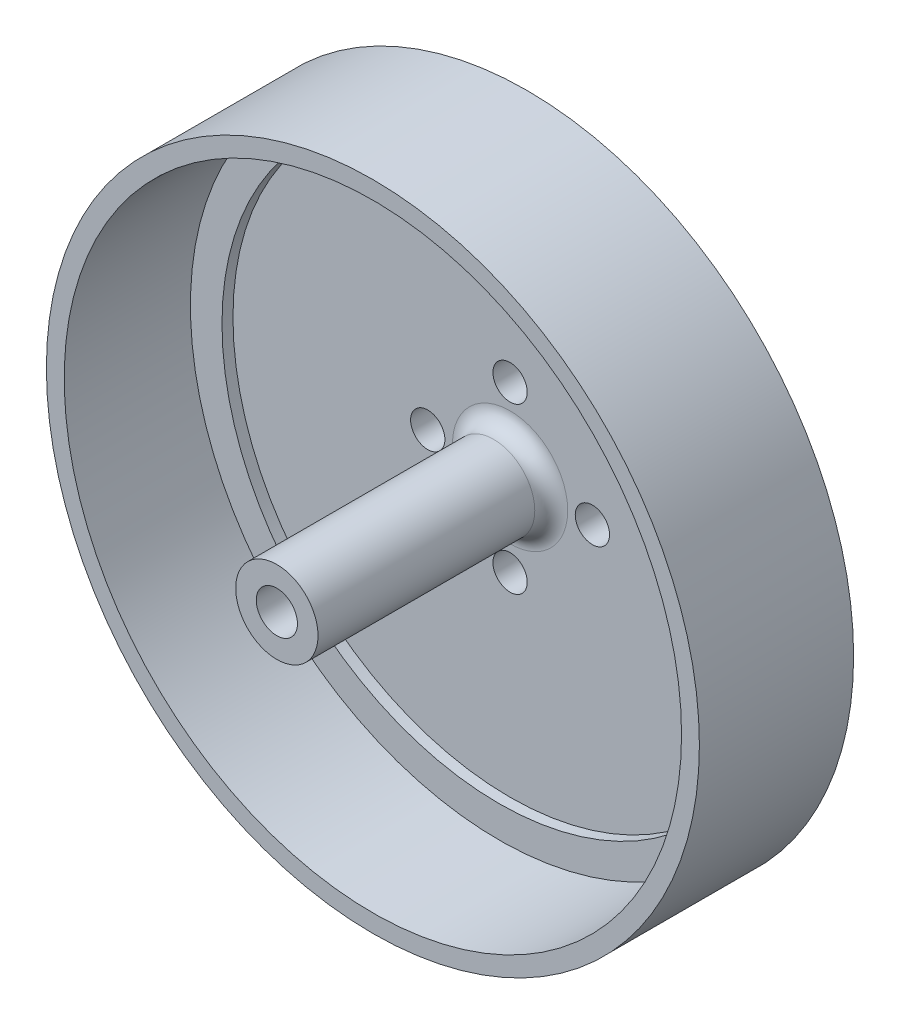
ISO-10303-21;
HEADER;
FILE_DESCRIPTION(('STEP AP214'),'2;1');
FILE_NAME('part.step','',(''),(''),'','','');
FILE_SCHEMA(('AUTOMOTIVE_DESIGN { 1 0 10303 214 1 1 1 1 }'));
ENDSEC;
DATA;
#1=APPLICATION_CONTEXT('core data for automotive mechanical design processes');
#2=APPLICATION_PROTOCOL_DEFINITION('international standard','automotive_design',2000,#1);
#3=PRODUCT_CONTEXT('',#1,'mechanical');
#4=PRODUCT('Part','Part','',(#3));
#5=PRODUCT_RELATED_PRODUCT_CATEGORY('part','',(#4));
#6=PRODUCT_DEFINITION_FORMATION('','',#4);
#7=PRODUCT_DEFINITION_CONTEXT('part definition',#1,'design');
#8=PRODUCT_DEFINITION('design','',#6,#7);
#9=PRODUCT_DEFINITION_SHAPE('','',#8);
#10=(LENGTH_UNIT() NAMED_UNIT(*) SI_UNIT(.MILLI.,.METRE.));
#11=(NAMED_UNIT(*) PLANE_ANGLE_UNIT() SI_UNIT($,.RADIAN.));
#12=(NAMED_UNIT(*) SI_UNIT($,.STERADIAN.) SOLID_ANGLE_UNIT());
#13=UNCERTAINTY_MEASURE_WITH_UNIT(LENGTH_MEASURE(1.E-05),#10,'distance_accuracy_value','');
#14=(GEOMETRIC_REPRESENTATION_CONTEXT(3) GLOBAL_UNCERTAINTY_ASSIGNED_CONTEXT((#13)) GLOBAL_UNIT_ASSIGNED_CONTEXT((#10,
#11,#12)) REPRESENTATION_CONTEXT('',''));
#15=CARTESIAN_POINT('',(0.,0.,0.));
#16=DIRECTION('',(0.,0.,1.));
#17=DIRECTION('',(1.,0.,0.));
#18=AXIS2_PLACEMENT_3D('',#15,#16,#17);
#19=CARTESIAN_POINT('',(0.,0.,-4.6));
#20=DIRECTION('',(0.,0.,1.));
#21=DIRECTION('',(1.,0.,0.));
#22=AXIS2_PLACEMENT_3D('',#19,#20,#21);
#23=CYLINDRICAL_SURFACE('',#22,2.);
#24=CARTESIAN_POINT('',(0.,0.,-1.6));
#25=DIRECTION('',(0.,0.,-1.));
#26=DIRECTION('',(-1.,0.,0.));
#27=AXIS2_PLACEMENT_3D('',#24,#25,#26);
#28=CIRCLE('',#27,2.);
#29=CARTESIAN_POINT('',(-2.,0.,-1.6));
#30=VERTEX_POINT('',#29);
#31=EDGE_CURVE('E343',#30,#30,#28,.T.);
#32=ORIENTED_EDGE('',*,*,#31,.T.);
#33=EDGE_LOOP('',(#32));
#34=FACE_BOUND('',#33,.T.);
#35=CARTESIAN_POINT('',(0.,0.,-2.25));
#36=DIRECTION('',(0.,0.,-1.));
#37=DIRECTION('',(-1.,0.,0.));
#38=AXIS2_PLACEMENT_3D('',#35,#36,#37);
#39=CIRCLE('',#38,2.);
#40=CARTESIAN_POINT('',(-2.,0.,-2.25));
#41=VERTEX_POINT('',#40);
#42=EDGE_CURVE('E40',#41,#41,#39,.T.);
#43=ORIENTED_EDGE('',*,*,#42,.F.);
#44=EDGE_LOOP('',(#43));
#45=FACE_BOUND('',#44,.T.);
#46=ADVANCED_FACE('F36',(#34,#45),#23,.T.);
#47=CARTESIAN_POINT('',(0.,0.,12.3));
#48=DIRECTION('',(0.,0.,-1.));
#49=DIRECTION('',(-1.,0.,0.));
#50=AXIS2_PLACEMENT_3D('',#47,#48,#49);
#51=CYLINDRICAL_SURFACE('',#50,20.2);
#52=CARTESIAN_POINT('',(0.,0.,2.3));
#53=DIRECTION('',(0.,0.,1.));
#54=DIRECTION('',(1.,0.,0.));
#55=AXIS2_PLACEMENT_3D('',#52,#53,#54);
#56=CIRCLE('',#55,20.2);
#57=CARTESIAN_POINT('',(20.2,0.,2.3));
#58=VERTEX_POINT('',#57);
#59=EDGE_CURVE('E77',#58,#58,#56,.F.);
#60=ORIENTED_EDGE('',*,*,#59,.T.);
#61=EDGE_LOOP('',(#60));
#62=FACE_BOUND('',#61,.T.);
#63=CARTESIAN_POINT('',(0.,0.,3.1));
#64=DIRECTION('',(0.,0.,1.));
#65=DIRECTION('',(1.,0.,0.));
#66=AXIS2_PLACEMENT_3D('',#63,#64,#65);
#67=CIRCLE('',#66,20.2);
#68=CARTESIAN_POINT('',(20.2,0.,3.1));
#69=VERTEX_POINT('',#68);
#70=EDGE_CURVE('E57',#69,#69,#67,.T.);
#71=ORIENTED_EDGE('',*,*,#70,.T.);
#72=EDGE_LOOP('',(#71));
#73=FACE_BOUND('',#72,.T.);
#74=ADVANCED_FACE('F118',(#62,#73),#51,.F.);
#75=CARTESIAN_POINT('',(0.,0.,2.3));
#76=DIRECTION('',(0.,0.,-1.));
#77=DIRECTION('',(-1.,0.,0.));
#78=AXIS2_PLACEMENT_3D('',#75,#76,#77);
#79=CYLINDRICAL_SURFACE('',#78,23.8);
#80=CARTESIAN_POINT('',(0.,0.,1.05796188425079));
#81=DIRECTION('',(0.,0.,1.));
#82=DIRECTION('',(1.,0.,0.));
#83=AXIS2_PLACEMENT_3D('',#80,#81,#82);
#84=CIRCLE('',#83,23.8);
#85=CARTESIAN_POINT('',(23.8,0.,1.05796188425079));
#86=VERTEX_POINT('',#85);
#87=EDGE_CURVE('E80',#86,#86,#84,.T.);
#88=ORIENTED_EDGE('',*,*,#87,.T.);
#89=EDGE_LOOP('',(#88));
#90=FACE_BOUND('',#89,.T.);
#91=CARTESIAN_POINT('',(0.,0.,12.3));
#92=DIRECTION('',(0.,0.,1.));
#93=DIRECTION('',(1.,0.,0.));
#94=AXIS2_PLACEMENT_3D('',#91,#92,#93);
#95=CIRCLE('',#94,23.8);
#96=CARTESIAN_POINT('',(23.8,0.,12.3));
#97=VERTEX_POINT('',#96);
#98=EDGE_CURVE('E73',#97,#97,#95,.T.);
#99=ORIENTED_EDGE('',*,*,#98,.F.);
#100=EDGE_LOOP('',(#99));
#101=FACE_BOUND('',#100,.T.);
#102=ADVANCED_FACE('F124',(#90,#101),#79,.T.);
#103=CARTESIAN_POINT('',(0.,0.,0.));
#104=DIRECTION('',(0.,0.,1.));
#105=DIRECTION('',(1.,0.,0.));
#106=AXIS2_PLACEMENT_3D('',#103,#104,#105);
#107=PLANE('',#106);
#108=CARTESIAN_POINT('',(0.,0.,0.));
#109=DIRECTION('',(0.,0.,-1.));
#110=DIRECTION('',(-1.,0.,0.));
#111=AXIS2_PLACEMENT_3D('',#108,#109,#110);
#112=CIRCLE('',#111,9.33925413639657);
#113=CARTESIAN_POINT('',(-9.33925413639657,0.,0.));
#114=VERTEX_POINT('',#113);
#115=EDGE_CURVE('E10',#114,#114,#112,.T.);
#116=ORIENTED_EDGE('',*,*,#115,.F.);
#117=EDGE_LOOP('',(#116));
#118=FACE_BOUND('',#117,.T.);
#119=CARTESIAN_POINT('',(0.,0.,0.));
#120=DIRECTION('',(0.,0.,1.));
#121=DIRECTION('',(1.,0.,0.));
#122=AXIS2_PLACEMENT_3D('',#119,#120,#121);
#123=CIRCLE('',#122,17.7999999999999);
#124=CARTESIAN_POINT('',(17.7999999999999,0.,0.));
#125=VERTEX_POINT('',#124);
#126=EDGE_CURVE('E83',#125,#125,#123,.F.);
#127=ORIENTED_EDGE('',*,*,#126,.T.);
#128=EDGE_LOOP('',(#127));
#129=FACE_BOUND('',#128,.T.);
#130=ADVANCED_FACE('F173',(#118,#129),#107,.F.);
#131=CARTESIAN_POINT('',(0.,0.,12.3));
#132=DIRECTION('',(0.,0.,1.));
#133=DIRECTION('',(1.,0.,0.));
#134=AXIS2_PLACEMENT_3D('',#131,#132,#133);
#135=PLANE('',#134);
#136=CARTESIAN_POINT('',(0.,0.,12.3));
#137=DIRECTION('',(0.,0.,1.));
#138=DIRECTION('',(1.,0.,0.));
#139=AXIS2_PLACEMENT_3D('',#136,#137,#138);
#140=CIRCLE('',#139,22.5);
#141=CARTESIAN_POINT('',(22.5,0.,12.3));
#142=VERTEX_POINT('',#141);
#143=EDGE_CURVE('E63',#142,#142,#140,.T.);
#144=ORIENTED_EDGE('',*,*,#143,.F.);
#145=EDGE_LOOP('',(#144));
#146=FACE_BOUND('',#145,.T.);
#147=ORIENTED_EDGE('',*,*,#98,.T.);
#148=EDGE_LOOP('',(#147));
#149=FACE_BOUND('',#148,.T.);
#150=ADVANCED_FACE('F170',(#146,#149),#135,.T.);
#151=CARTESIAN_POINT('',(0.,0.,2.3));
#152=DIRECTION('',(0.,0.,1.));
#153=DIRECTION('',(1.,0.,0.));
#154=AXIS2_PLACEMENT_3D('',#151,#152,#153);
#155=PLANE('',#154);
#156=CARTESIAN_POINT('',(0.,0.,2.3));
#157=DIRECTION('',(0.,0.,1.));
#158=DIRECTION('',(1.,0.,0.));
#159=AXIS2_PLACEMENT_3D('',#156,#157,#158);
#160=CIRCLE('',#159,4.2);
#161=CARTESIAN_POINT('',(4.2,0.,2.3));
#162=VERTEX_POINT('',#161);
#163=EDGE_CURVE('E44',#162,#162,#160,.F.);
#164=ORIENTED_EDGE('',*,*,#163,.T.);
#165=EDGE_LOOP('',(#164));
#166=FACE_BOUND('',#165,.T.);
#167=CARTESIAN_POINT('',(-6.,0.,2.3));
#168=DIRECTION('',(0.,0.,1.));
#169=DIRECTION('',(1.,0.,0.));
#170=AXIS2_PLACEMENT_3D('',#167,#168,#169);
#171=CIRCLE('',#170,1.25);
#172=CARTESIAN_POINT('',(-4.75,0.,2.3));
#173=VERTEX_POINT('',#172);
#174=EDGE_CURVE('E74',#173,#173,#171,.T.);
#175=ORIENTED_EDGE('',*,*,#174,.F.);
#176=EDGE_LOOP('',(#175));
#177=FACE_BOUND('',#176,.T.);
#178=CARTESIAN_POINT('',(0.,-6.,2.3));
#179=DIRECTION('',(0.,0.,1.));
#180=DIRECTION('',(1.,0.,0.));
#181=AXIS2_PLACEMENT_3D('',#178,#179,#180);
#182=CIRCLE('',#181,1.25);
#183=CARTESIAN_POINT('',(1.25000000000002,-6.,2.3));
#184=VERTEX_POINT('',#183);
#185=EDGE_CURVE('E91',#184,#184,#182,.T.);
#186=ORIENTED_EDGE('',*,*,#185,.F.);
#187=EDGE_LOOP('',(#186));
#188=FACE_BOUND('',#187,.T.);
#189=CARTESIAN_POINT('',(6.,0.,2.3));
#190=DIRECTION('',(0.,0.,1.));
#191=DIRECTION('',(1.,0.,0.));
#192=AXIS2_PLACEMENT_3D('',#189,#190,#191);
#193=CIRCLE('',#192,1.25);
#194=CARTESIAN_POINT('',(7.25,0.,2.3));
#195=VERTEX_POINT('',#194);
#196=EDGE_CURVE('E88',#195,#195,#193,.T.);
#197=ORIENTED_EDGE('',*,*,#196,.F.);
#198=EDGE_LOOP('',(#197));
#199=FACE_BOUND('',#198,.T.);
#200=CARTESIAN_POINT('',(0.,6.,2.3));
#201=DIRECTION('',(0.,0.,1.));
#202=DIRECTION('',(1.,0.,0.));
#203=AXIS2_PLACEMENT_3D('',#200,#201,#202);
#204=CIRCLE('',#203,1.25);
#205=CARTESIAN_POINT('',(1.24999999999994,6.,2.3));
#206=VERTEX_POINT('',#205);
#207=EDGE_CURVE('E67',#206,#206,#204,.T.);
#208=ORIENTED_EDGE('',*,*,#207,.F.);
#209=EDGE_LOOP('',(#208));
#210=FACE_BOUND('',#209,.T.);
#211=ORIENTED_EDGE('',*,*,#59,.F.);
#212=EDGE_LOOP('',(#211));
#213=FACE_BOUND('',#212,.T.);
#214=ADVANCED_FACE('F168',(#166,#177,#188,#199,#210,#213),#155,.T.);
#215=CARTESIAN_POINT('',(0.,0.,19.3));
#216=DIRECTION('',(0.,0.,-1.));
#217=DIRECTION('',(-1.,0.,0.));
#218=AXIS2_PLACEMENT_3D('',#215,#216,#217);
#219=CYLINDRICAL_SURFACE('',#218,3.);
#220=CARTESIAN_POINT('',(0.,0.,3.5));
#221=DIRECTION('',(0.,0.,1.));
#222=DIRECTION('',(1.,0.,0.));
#223=AXIS2_PLACEMENT_3D('',#220,#221,#222);
#224=CIRCLE('',#223,3.);
#225=CARTESIAN_POINT('',(3.,0.,3.5));
#226=VERTEX_POINT('',#225);
#227=EDGE_CURVE('E49',#226,#226,#224,.T.);
#228=ORIENTED_EDGE('',*,*,#227,.T.);
#229=EDGE_LOOP('',(#228));
#230=FACE_BOUND('',#229,.T.);
#231=CARTESIAN_POINT('',(0.,0.,19.3));
#232=DIRECTION('',(0.,0.,1.));
#233=DIRECTION('',(1.,0.,0.));
#234=AXIS2_PLACEMENT_3D('',#231,#232,#233);
#235=CIRCLE('',#234,3.);
#236=CARTESIAN_POINT('',(3.,0.,19.3));
#237=VERTEX_POINT('',#236);
#238=EDGE_CURVE('E70',#237,#237,#235,.T.);
#239=ORIENTED_EDGE('',*,*,#238,.F.);
#240=EDGE_LOOP('',(#239));
#241=FACE_BOUND('',#240,.T.);
#242=ADVANCED_FACE('F99',(#230,#241),#219,.T.);
#243=CARTESIAN_POINT('',(0.,0.,19.3));
#244=DIRECTION('',(0.,0.,1.));
#245=DIRECTION('',(1.,0.,0.));
#246=AXIS2_PLACEMENT_3D('',#243,#244,#245);
#247=PLANE('',#246);
#248=CARTESIAN_POINT('',(0.,0.,19.3));
#249=DIRECTION('',(0.,0.,1.));
#250=DIRECTION('',(1.,0.,0.));
#251=AXIS2_PLACEMENT_3D('',#248,#249,#250);
#252=CIRCLE('',#251,1.5);
#253=CARTESIAN_POINT('',(1.5,0.,19.3));
#254=VERTEX_POINT('',#253);
#255=EDGE_CURVE('E58',#254,#254,#252,.T.);
#256=ORIENTED_EDGE('',*,*,#255,.F.);
#257=EDGE_LOOP('',(#256));
#258=FACE_BOUND('',#257,.T.);
#259=ORIENTED_EDGE('',*,*,#238,.T.);
#260=EDGE_LOOP('',(#259));
#261=FACE_BOUND('',#260,.T.);
#262=ADVANCED_FACE('F163',(#258,#261),#247,.T.);
#263=CARTESIAN_POINT('',(0.,0.,1.05796188425079));
#264=DIRECTION('',(0.,0.,1.));
#265=DIRECTION('',(1.,0.,0.));
#266=AXIS2_PLACEMENT_3D('',#263,#264,#265);
#267=CONICAL_SURFACE('',#266,23.8,1.39626340159547);
#268=ORIENTED_EDGE('',*,*,#126,.F.);
#269=EDGE_LOOP('',(#268));
#270=FACE_BOUND('',#269,.T.);
#271=ORIENTED_EDGE('',*,*,#87,.F.);
#272=EDGE_LOOP('',(#271));
#273=FACE_BOUND('',#272,.T.);
#274=ADVANCED_FACE('F161',(#270,#273),#267,.T.);
#275=CARTESIAN_POINT('',(0.,6.,15.));
#276=DIRECTION('',(0.,0.,-1.));
#277=DIRECTION('',(-1.,0.,0.));
#278=AXIS2_PLACEMENT_3D('',#275,#276,#277);
#279=CYLINDRICAL_SURFACE('',#278,1.25);
#280=ORIENTED_EDGE('',*,*,#207,.T.);
#281=EDGE_LOOP('',(#280));
#282=FACE_BOUND('',#281,.T.);
#283=CARTESIAN_POINT('',(0.,6.,-1.6));
#284=DIRECTION('',(0.,0.,-1.));
#285=DIRECTION('',(-1.,0.,0.));
#286=AXIS2_PLACEMENT_3D('',#283,#284,#285);
#287=CIRCLE('',#286,1.25);
#288=CARTESIAN_POINT('',(-1.25000000000006,6.,-1.6));
#289=VERTEX_POINT('',#288);
#290=EDGE_CURVE('E355',#289,#289,#287,.T.);
#291=ORIENTED_EDGE('',*,*,#290,.T.);
#292=EDGE_LOOP('',(#291));
#293=FACE_BOUND('',#292,.T.);
#294=ADVANCED_FACE('F157',(#282,#293),#279,.F.);
#295=CARTESIAN_POINT('',(6.,0.,15.));
#296=DIRECTION('',(0.,0.,-1.));
#297=DIRECTION('',(-1.,0.,0.));
#298=AXIS2_PLACEMENT_3D('',#295,#296,#297);
#299=CYLINDRICAL_SURFACE('',#298,1.25);
#300=ORIENTED_EDGE('',*,*,#196,.T.);
#301=EDGE_LOOP('',(#300));
#302=FACE_BOUND('',#301,.T.);
#303=CARTESIAN_POINT('',(6.,0.,-1.6));
#304=DIRECTION('',(0.,0.,-1.));
#305=DIRECTION('',(-1.,0.,0.));
#306=AXIS2_PLACEMENT_3D('',#303,#304,#305);
#307=CIRCLE('',#306,1.25);
#308=CARTESIAN_POINT('',(4.75,0.,-1.6));
#309=VERTEX_POINT('',#308);
#310=EDGE_CURVE('E344',#309,#309,#307,.T.);
#311=ORIENTED_EDGE('',*,*,#310,.T.);
#312=EDGE_LOOP('',(#311));
#313=FACE_BOUND('',#312,.T.);
#314=ADVANCED_FACE('F153',(#302,#313),#299,.F.);
#315=CARTESIAN_POINT('',(0.,-6.,15.));
#316=DIRECTION('',(0.,0.,-1.));
#317=DIRECTION('',(-1.,0.,0.));
#318=AXIS2_PLACEMENT_3D('',#315,#316,#317);
#319=CYLINDRICAL_SURFACE('',#318,1.25);
#320=ORIENTED_EDGE('',*,*,#185,.T.);
#321=EDGE_LOOP('',(#320));
#322=FACE_BOUND('',#321,.T.);
#323=CARTESIAN_POINT('',(0.,-6.,-1.6));
#324=DIRECTION('',(0.,0.,-1.));
#325=DIRECTION('',(-1.,0.,0.));
#326=AXIS2_PLACEMENT_3D('',#323,#324,#325);
#327=CIRCLE('',#326,1.25);
#328=CARTESIAN_POINT('',(-1.24999999999998,-6.,-1.6));
#329=VERTEX_POINT('',#328);
#330=EDGE_CURVE('E348',#329,#329,#327,.T.);
#331=ORIENTED_EDGE('',*,*,#330,.T.);
#332=EDGE_LOOP('',(#331));
#333=FACE_BOUND('',#332,.T.);
#334=ADVANCED_FACE('F149',(#322,#333),#319,.F.);
#335=CARTESIAN_POINT('',(-6.,0.,15.));
#336=DIRECTION('',(0.,0.,-1.));
#337=DIRECTION('',(-1.,0.,0.));
#338=AXIS2_PLACEMENT_3D('',#335,#336,#337);
#339=CYLINDRICAL_SURFACE('',#338,1.25);
#340=ORIENTED_EDGE('',*,*,#174,.T.);
#341=EDGE_LOOP('',(#340));
#342=FACE_BOUND('',#341,.T.);
#343=CARTESIAN_POINT('',(-6.,0.,-1.6));
#344=DIRECTION('',(0.,0.,-1.));
#345=DIRECTION('',(-1.,0.,0.));
#346=AXIS2_PLACEMENT_3D('',#343,#344,#345);
#347=CIRCLE('',#346,1.25);
#348=CARTESIAN_POINT('',(-7.25,0.,-1.6));
#349=VERTEX_POINT('',#348);
#350=EDGE_CURVE('E353',#349,#349,#347,.T.);
#351=ORIENTED_EDGE('',*,*,#350,.T.);
#352=EDGE_LOOP('',(#351));
#353=FACE_BOUND('',#352,.T.);
#354=ADVANCED_FACE('F145',(#342,#353),#339,.F.);
#355=CARTESIAN_POINT('',(0.,0.,3.1));
#356=DIRECTION('',(0.,0.,1.));
#357=DIRECTION('',(1.,0.,0.));
#358=AXIS2_PLACEMENT_3D('',#355,#356,#357);
#359=CYLINDRICAL_SURFACE('',#358,22.5);
#360=CARTESIAN_POINT('',(0.,0.,3.1));
#361=DIRECTION('',(0.,0.,1.));
#362=DIRECTION('',(1.,0.,0.));
#363=AXIS2_PLACEMENT_3D('',#360,#361,#362);
#364=CIRCLE('',#363,22.5);
#365=CARTESIAN_POINT('',(22.5,0.,3.1));
#366=VERTEX_POINT('',#365);
#367=EDGE_CURVE('E64',#366,#366,#364,.T.);
#368=ORIENTED_EDGE('',*,*,#367,.F.);
#369=EDGE_LOOP('',(#368));
#370=FACE_BOUND('',#369,.T.);
#371=ORIENTED_EDGE('',*,*,#143,.T.);
#372=EDGE_LOOP('',(#371));
#373=FACE_BOUND('',#372,.T.);
#374=ADVANCED_FACE('F141',(#370,#373),#359,.F.);
#375=CARTESIAN_POINT('',(0.,0.,3.1));
#376=DIRECTION('',(0.,0.,1.));
#377=DIRECTION('',(1.,0.,0.));
#378=AXIS2_PLACEMENT_3D('',#375,#376,#377);
#379=PLANE('',#378);
#380=ORIENTED_EDGE('',*,*,#70,.F.);
#381=EDGE_LOOP('',(#380));
#382=FACE_BOUND('',#381,.T.);
#383=ORIENTED_EDGE('',*,*,#367,.T.);
#384=EDGE_LOOP('',(#383));
#385=FACE_BOUND('',#384,.T.);
#386=ADVANCED_FACE('F137',(#382,#385),#379,.T.);
#387=CARTESIAN_POINT('',(0.,0.,14.3));
#388=DIRECTION('',(0.,0.,1.));
#389=DIRECTION('',(1.,0.,0.));
#390=AXIS2_PLACEMENT_3D('',#387,#388,#389);
#391=CYLINDRICAL_SURFACE('',#390,1.5);
#392=CARTESIAN_POINT('',(0.,0.,14.3));
#393=DIRECTION('',(0.,0.,1.));
#394=DIRECTION('',(1.,0.,0.));
#395=AXIS2_PLACEMENT_3D('',#392,#393,#394);
#396=CIRCLE('',#395,1.5);
#397=CARTESIAN_POINT('',(1.5,0.,14.3));
#398=VERTEX_POINT('',#397);
#399=EDGE_CURVE('E54',#398,#398,#396,.T.);
#400=ORIENTED_EDGE('',*,*,#399,.F.);
#401=EDGE_LOOP('',(#400));
#402=FACE_BOUND('',#401,.T.);
#403=ORIENTED_EDGE('',*,*,#255,.T.);
#404=EDGE_LOOP('',(#403));
#405=FACE_BOUND('',#404,.T.);
#406=ADVANCED_FACE('F113',(#402,#405),#391,.F.);
#407=CARTESIAN_POINT('',(0.,0.,14.3));
#408=DIRECTION('',(0.,0.,1.));
#409=DIRECTION('',(1.,0.,0.));
#410=AXIS2_PLACEMENT_3D('',#407,#408,#409);
#411=PLANE('',#410);
#412=ORIENTED_EDGE('',*,*,#399,.T.);
#413=EDGE_LOOP('',(#412));
#414=FACE_BOUND('',#413,.T.);
#415=ADVANCED_FACE('F104',(#414),#411,.T.);
#416=CARTESIAN_POINT('',(0.,0.,3.5));
#417=DIRECTION('',(0.,0.,1.));
#418=DIRECTION('',(1.,0.,0.));
#419=AXIS2_PLACEMENT_3D('',#416,#417,#418);
#420=TOROIDAL_SURFACE('',#419,4.2,1.2);
#421=ORIENTED_EDGE('',*,*,#163,.F.);
#422=EDGE_LOOP('',(#421));
#423=FACE_BOUND('',#422,.T.);
#424=ORIENTED_EDGE('',*,*,#227,.F.);
#425=EDGE_LOOP('',(#424));
#426=FACE_BOUND('',#425,.T.);
#427=ADVANCED_FACE('F38',(#423,#426),#420,.F.);
#428=CARTESIAN_POINT('',(0.,0.,-1.6));
#429=DIRECTION('',(0.,0.,-1.));
#430=DIRECTION('',(-1.,0.,0.));
#431=AXIS2_PLACEMENT_3D('',#428,#429,#430);
#432=PLANE('',#431);
#433=ORIENTED_EDGE('',*,*,#31,.F.);
#434=EDGE_LOOP('',(#433));
#435=FACE_BOUND('',#434,.T.);
#436=ORIENTED_EDGE('',*,*,#330,.F.);
#437=EDGE_LOOP('',(#436));
#438=FACE_BOUND('',#437,.T.);
#439=ORIENTED_EDGE('',*,*,#290,.F.);
#440=EDGE_LOOP('',(#439));
#441=FACE_BOUND('',#440,.T.);
#442=CARTESIAN_POINT('',(0.,0.,-1.6));
#443=DIRECTION('',(0.,0.,-1.));
#444=DIRECTION('',(-1.,0.,0.));
#445=AXIS2_PLACEMENT_3D('',#442,#443,#444);
#446=CIRCLE('',#445,9.33925413639657);
#447=CARTESIAN_POINT('',(-9.33925413639657,0.,-1.6));
#448=VERTEX_POINT('',#447);
#449=EDGE_CURVE('E52',#448,#448,#446,.T.);
#450=ORIENTED_EDGE('',*,*,#449,.T.);
#451=EDGE_LOOP('',(#450));
#452=FACE_BOUND('',#451,.T.);
#453=ORIENTED_EDGE('',*,*,#350,.F.);
#454=EDGE_LOOP('',(#453));
#455=FACE_BOUND('',#454,.T.);
#456=ORIENTED_EDGE('',*,*,#310,.F.);
#457=EDGE_LOOP('',(#456));
#458=FACE_BOUND('',#457,.T.);
#459=ADVANCED_FACE('F103',(#435,#438,#441,#452,#455,#458),#432,.T.);
#460=CARTESIAN_POINT('',(0.,0.,-1.6));
#461=DIRECTION('',(0.,0.,1.));
#462=DIRECTION('',(1.,0.,0.));
#463=AXIS2_PLACEMENT_3D('',#460,#461,#462);
#464=CYLINDRICAL_SURFACE('',#463,9.33925413639657);
#465=ORIENTED_EDGE('',*,*,#449,.F.);
#466=EDGE_LOOP('',(#465));
#467=FACE_BOUND('',#466,.T.);
#468=ORIENTED_EDGE('',*,*,#115,.T.);
#469=EDGE_LOOP('',(#468));
#470=FACE_BOUND('',#469,.T.);
#471=ADVANCED_FACE('F110',(#467,#470),#464,.T.);
#472=CARTESIAN_POINT('',(0.,0.,-2.25));
#473=DIRECTION('',(0.,0.,-1.));
#474=DIRECTION('',(-1.,0.,0.));
#475=AXIS2_PLACEMENT_3D('',#472,#473,#474);
#476=PLANE('',#475);
#477=ORIENTED_EDGE('',*,*,#42,.T.);
#478=EDGE_LOOP('',(#477));
#479=FACE_BOUND('',#478,.T.);
#480=ADVANCED_FACE('F130',(#479),#476,.T.);
#481=CLOSED_SHELL('',(#46,#74,#102,#130,#150,#214,#242,#262,#274,#294,#314,#334,#354,#374,#386,
#406,#415,#427,#459,#471,#480));
#482=MANIFOLD_SOLID_BREP('B2',#481);
#483=ADVANCED_BREP_SHAPE_REPRESENTATION('',(#18,#482),#14);
#484=SHAPE_DEFINITION_REPRESENTATION(#9,#483);
ENDSEC;
END-ISO-10303-21;
